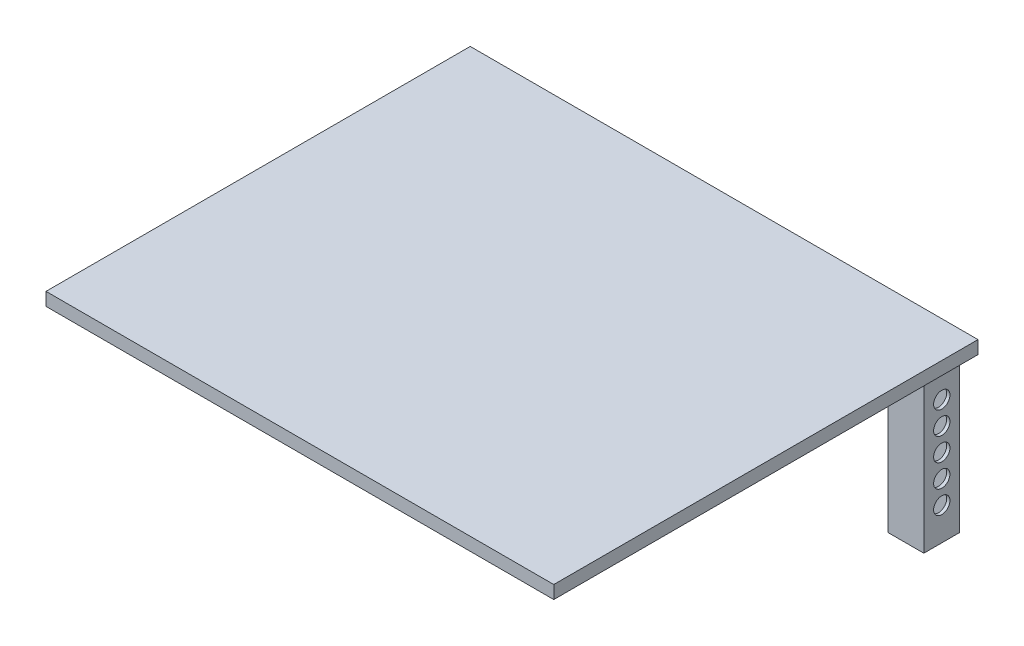
ISO-10303-21;
HEADER;
FILE_DESCRIPTION(('STEP AP214'),'2;1');
FILE_NAME('part.step','',(''),(''),'','','');
FILE_SCHEMA(('AUTOMOTIVE_DESIGN { 1 0 10303 214 1 1 1 1 }'));
ENDSEC;
DATA;
#1=APPLICATION_CONTEXT('core data for automotive mechanical design processes');
#2=APPLICATION_PROTOCOL_DEFINITION('international standard','automotive_design',2000,#1);
#3=PRODUCT_CONTEXT('',#1,'mechanical');
#4=PRODUCT('Part','Part','',(#3));
#5=PRODUCT_RELATED_PRODUCT_CATEGORY('part','',(#4));
#6=PRODUCT_DEFINITION_FORMATION('','',#4);
#7=PRODUCT_DEFINITION_CONTEXT('part definition',#1,'design');
#8=PRODUCT_DEFINITION('design','',#6,#7);
#9=PRODUCT_DEFINITION_SHAPE('','',#8);
#10=(LENGTH_UNIT() NAMED_UNIT(*) SI_UNIT(.MILLI.,.METRE.));
#11=(NAMED_UNIT(*) PLANE_ANGLE_UNIT() SI_UNIT($,.RADIAN.));
#12=(NAMED_UNIT(*) SI_UNIT($,.STERADIAN.) SOLID_ANGLE_UNIT());
#13=UNCERTAINTY_MEASURE_WITH_UNIT(LENGTH_MEASURE(1.E-05),#10,'distance_accuracy_value','');
#14=(GEOMETRIC_REPRESENTATION_CONTEXT(3) GLOBAL_UNCERTAINTY_ASSIGNED_CONTEXT((#13)) GLOBAL_UNIT_ASSIGNED_CONTEXT((#10,
#11,#12)) REPRESENTATION_CONTEXT('',''));
#15=CARTESIAN_POINT('',(0.,0.,0.));
#16=DIRECTION('',(0.,0.,1.));
#17=DIRECTION('',(1.,0.,0.));
#18=AXIS2_PLACEMENT_3D('',#15,#16,#17);
#19=CARTESIAN_POINT('',(-13.97,127.,-13.97));
#20=DIRECTION('',(0.,0.,1.));
#21=DIRECTION('',(1.,0.,0.));
#22=AXIS2_PLACEMENT_3D('',#19,#20,#21);
#23=PLANE('',#22);
#24=DIRECTION('',(0.,1.,0.));
#25=VECTOR('',#24,1.);
#26=CARTESIAN_POINT('',(28.1939999999999,127.,-13.97));
#27=LINE('',#26,#25);
#28=CARTESIAN_POINT('',(28.1939999999999,127.,-13.97));
#29=VERTEX_POINT('',#28);
#30=CARTESIAN_POINT('',(28.1939999999999,137.16,-13.97));
#31=VERTEX_POINT('',#30);
#32=EDGE_CURVE('E144',#29,#31,#27,.T.);
#33=ORIENTED_EDGE('',*,*,#32,.F.);
#34=DIRECTION('',(-1.,0.,0.));
#35=VECTOR('',#34,1.);
#36=CARTESIAN_POINT('',(217.17,127.,-13.97));
#37=LINE('',#36,#35);
#38=CARTESIAN_POINT('',(13.97,127.,-13.97));
#39=VERTEX_POINT('',#38);
#40=EDGE_CURVE('E143',#29,#39,#37,.T.);
#41=ORIENTED_EDGE('',*,*,#40,.T.);
#42=DIRECTION('',(0.,-1.,0.));
#43=VECTOR('',#42,1.);
#44=CARTESIAN_POINT('',(13.97,127.,-13.97));
#45=LINE('',#44,#43);
#46=CARTESIAN_POINT('',(13.97,0.,-13.97));
#47=VERTEX_POINT('',#46);
#48=EDGE_CURVE('E43',#39,#47,#45,.T.);
#49=ORIENTED_EDGE('',*,*,#48,.T.);
#50=DIRECTION('',(-1.,0.,0.));
#51=VECTOR('',#50,1.);
#52=CARTESIAN_POINT('',(-13.97,0.,-13.97));
#53=LINE('',#52,#51);
#54=CARTESIAN_POINT('',(-13.97,0.,-13.97));
#55=VERTEX_POINT('',#54);
#56=EDGE_CURVE('E208',#47,#55,#53,.T.);
#57=ORIENTED_EDGE('',*,*,#56,.T.);
#58=DIRECTION('',(0.,-1.,0.));
#59=VECTOR('',#58,1.);
#60=CARTESIAN_POINT('',(-13.97,127.,-13.97));
#61=LINE('',#60,#59);
#62=CARTESIAN_POINT('',(-13.97,127.,-13.97));
#63=VERTEX_POINT('',#62);
#64=EDGE_CURVE('E217',#63,#55,#61,.T.);
#65=ORIENTED_EDGE('',*,*,#64,.F.);
#66=DIRECTION('',(-1.,0.,0.));
#67=VECTOR('',#66,1.);
#68=CARTESIAN_POINT('',(13.97,127.,-13.97));
#69=LINE('',#68,#67);
#70=CARTESIAN_POINT('',(-367.03,127.,-13.97));
#71=VERTEX_POINT('',#70);
#72=EDGE_CURVE('E155',#63,#71,#69,.T.);
#73=ORIENTED_EDGE('',*,*,#72,.T.);
#74=DIRECTION('',(0.,-1.,0.));
#75=VECTOR('',#74,1.);
#76=CARTESIAN_POINT('',(-367.03,137.16,-13.97));
#77=LINE('',#76,#75);
#78=CARTESIAN_POINT('',(-367.03,137.16,-13.97));
#79=VERTEX_POINT('',#78);
#80=EDGE_CURVE('E160',#79,#71,#77,.T.);
#81=ORIENTED_EDGE('',*,*,#80,.F.);
#82=DIRECTION('',(-1.,0.,0.));
#83=VECTOR('',#82,1.);
#84=CARTESIAN_POINT('',(13.97,137.16,-13.97));
#85=LINE('',#84,#83);
#86=EDGE_CURVE('E150',#31,#79,#85,.T.);
#87=ORIENTED_EDGE('',*,*,#86,.F.);
#88=EDGE_LOOP('',(#33,#41,#49,#57,#65,#73,#81,#87));
#89=FACE_BOUND('',#88,.T.);
#90=ADVANCED_FACE('F39',(#89),#23,.F.);
#91=CARTESIAN_POINT('',(0.,127.,0.));
#92=DIRECTION('',(0.,-1.,0.));
#93=DIRECTION('',(0.,0.,-1.));
#94=AXIS2_PLACEMENT_3D('',#91,#92,#93);
#95=PLANE('',#94);
#96=ORIENTED_EDGE('',*,*,#40,.F.);
#97=DIRECTION('',(0.,0.,-1.));
#98=VECTOR('',#97,1.);
#99=CARTESIAN_POINT('',(28.1939999999999,127.,316.23));
#100=LINE('',#99,#98);
#101=CARTESIAN_POINT('',(28.1939999999999,127.,316.23));
#102=VERTEX_POINT('',#101);
#103=EDGE_CURVE('E130',#102,#29,#100,.T.);
#104=ORIENTED_EDGE('',*,*,#103,.F.);
#105=DIRECTION('',(1.,0.,0.));
#106=VECTOR('',#105,1.);
#107=CARTESIAN_POINT('',(13.97,127.,316.23));
#108=LINE('',#107,#106);
#109=CARTESIAN_POINT('',(-367.03,127.,316.23));
#110=VERTEX_POINT('',#109);
#111=EDGE_CURVE('E142',#110,#102,#108,.T.);
#112=ORIENTED_EDGE('',*,*,#111,.F.);
#113=DIRECTION('',(0.,0.,1.));
#114=VECTOR('',#113,1.);
#115=CARTESIAN_POINT('',(-367.03,127.,-13.97));
#116=LINE('',#115,#114);
#117=EDGE_CURVE('E151',#71,#110,#116,.T.);
#118=ORIENTED_EDGE('',*,*,#117,.F.);
#119=ORIENTED_EDGE('',*,*,#72,.F.);
#120=DIRECTION('',(0.,0.,1.));
#121=VECTOR('',#120,1.);
#122=CARTESIAN_POINT('',(-13.97,127.,-13.97));
#123=LINE('',#122,#121);
#124=CARTESIAN_POINT('',(-13.97,127.,13.97));
#125=VERTEX_POINT('',#124);
#126=EDGE_CURVE('E198',#63,#125,#123,.T.);
#127=ORIENTED_EDGE('',*,*,#126,.T.);
#128=DIRECTION('',(1.,0.,0.));
#129=VECTOR('',#128,1.);
#130=CARTESIAN_POINT('',(-13.97,127.,13.97));
#131=LINE('',#130,#129);
#132=CARTESIAN_POINT('',(13.97,127.,13.97));
#133=VERTEX_POINT('',#132);
#134=EDGE_CURVE('E201',#125,#133,#131,.T.);
#135=ORIENTED_EDGE('',*,*,#134,.T.);
#136=DIRECTION('',(0.,0.,-1.));
#137=VECTOR('',#136,1.);
#138=CARTESIAN_POINT('',(13.97,127.,316.23));
#139=LINE('',#138,#137);
#140=EDGE_CURVE('E11',#133,#39,#139,.T.);
#141=ORIENTED_EDGE('',*,*,#140,.T.);
#142=EDGE_LOOP('',(#96,#104,#112,#118,#119,#127,#135,#141));
#143=FACE_BOUND('',#142,.T.);
#144=ADVANCED_FACE('F140',(#143),#95,.T.);
#145=CARTESIAN_POINT('',(0.,137.16,0.));
#146=DIRECTION('',(0.,-1.,0.));
#147=DIRECTION('',(0.,0.,-1.));
#148=AXIS2_PLACEMENT_3D('',#145,#146,#147);
#149=PLANE('',#148);
#150=DIRECTION('',(0.,0.,1.));
#151=VECTOR('',#150,1.);
#152=CARTESIAN_POINT('',(28.1939999999999,137.16,-13.97));
#153=LINE('',#152,#151);
#154=CARTESIAN_POINT('',(28.1939999999999,137.16,316.23));
#155=VERTEX_POINT('',#154);
#156=EDGE_CURVE('E55',#31,#155,#153,.T.);
#157=ORIENTED_EDGE('',*,*,#156,.F.);
#158=ORIENTED_EDGE('',*,*,#86,.T.);
#159=DIRECTION('',(0.,0.,1.));
#160=VECTOR('',#159,1.);
#161=CARTESIAN_POINT('',(-367.03,137.16,-13.97));
#162=LINE('',#161,#160);
#163=CARTESIAN_POINT('',(-367.03,137.16,316.23));
#164=VERTEX_POINT('',#163);
#165=EDGE_CURVE('E153',#79,#164,#162,.T.);
#166=ORIENTED_EDGE('',*,*,#165,.T.);
#167=DIRECTION('',(1.,0.,0.));
#168=VECTOR('',#167,1.);
#169=CARTESIAN_POINT('',(13.97,137.16,316.23));
#170=LINE('',#169,#168);
#171=EDGE_CURVE('E161',#164,#155,#170,.T.);
#172=ORIENTED_EDGE('',*,*,#171,.T.);
#173=EDGE_LOOP('',(#157,#158,#166,#172));
#174=FACE_BOUND('',#173,.T.);
#175=ADVANCED_FACE('F250',(#174),#149,.F.);
#176=CARTESIAN_POINT('',(13.97,137.16,316.23));
#177=DIRECTION('',(0.,0.,-1.));
#178=DIRECTION('',(-1.,0.,0.));
#179=AXIS2_PLACEMENT_3D('',#176,#177,#178);
#180=PLANE('',#179);
#181=DIRECTION('',(0.,-1.,0.));
#182=VECTOR('',#181,1.);
#183=CARTESIAN_POINT('',(28.1939999999999,137.16,316.23));
#184=LINE('',#183,#182);
#185=EDGE_CURVE('E127',#155,#102,#184,.T.);
#186=ORIENTED_EDGE('',*,*,#185,.F.);
#187=ORIENTED_EDGE('',*,*,#171,.F.);
#188=DIRECTION('',(0.,-1.,0.));
#189=VECTOR('',#188,1.);
#190=CARTESIAN_POINT('',(-367.03,137.16,316.23));
#191=LINE('',#190,#189);
#192=EDGE_CURVE('E149',#164,#110,#191,.T.);
#193=ORIENTED_EDGE('',*,*,#192,.T.);
#194=ORIENTED_EDGE('',*,*,#111,.T.);
#195=EDGE_LOOP('',(#186,#187,#193,#194));
#196=FACE_BOUND('',#195,.T.);
#197=ADVANCED_FACE('F147',(#196),#180,.F.);
#198=CARTESIAN_POINT('',(13.97,127.,-13.97));
#199=DIRECTION('',(-1.,0.,0.));
#200=DIRECTION('',(0.,0.,1.));
#201=AXIS2_PLACEMENT_3D('',#198,#199,#200);
#202=PLANE('',#201);
#203=CARTESIAN_POINT('',(13.97,96.52,0.));
#204=DIRECTION('',(1.,0.,0.));
#205=DIRECTION('',(0.,0.,-1.));
#206=AXIS2_PLACEMENT_3D('',#203,#204,#205);
#207=CIRCLE('',#206,6.35);
#208=CARTESIAN_POINT('',(13.97,96.52,-6.35));
#209=VERTEX_POINT('',#208);
#210=EDGE_CURVE('E455',#209,#209,#207,.T.);
#211=ORIENTED_EDGE('',*,*,#210,.F.);
#212=EDGE_LOOP('',(#211));
#213=FACE_BOUND('',#212,.T.);
#214=CARTESIAN_POINT('',(13.97,78.74,0.));
#215=DIRECTION('',(1.,0.,0.));
#216=DIRECTION('',(0.,0.,-1.));
#217=AXIS2_PLACEMENT_3D('',#214,#215,#216);
#218=CIRCLE('',#217,6.35);
#219=CARTESIAN_POINT('',(13.97,78.74,-6.35));
#220=VERTEX_POINT('',#219);
#221=EDGE_CURVE('E441',#220,#220,#218,.T.);
#222=ORIENTED_EDGE('',*,*,#221,.F.);
#223=EDGE_LOOP('',(#222));
#224=FACE_BOUND('',#223,.T.);
#225=CARTESIAN_POINT('',(13.97,60.96,0.));
#226=DIRECTION('',(1.,0.,0.));
#227=DIRECTION('',(0.,0.,-1.));
#228=AXIS2_PLACEMENT_3D('',#225,#226,#227);
#229=CIRCLE('',#228,6.35);
#230=CARTESIAN_POINT('',(13.97,60.96,-6.35));
#231=VERTEX_POINT('',#230);
#232=EDGE_CURVE('E446',#231,#231,#229,.T.);
#233=ORIENTED_EDGE('',*,*,#232,.F.);
#234=EDGE_LOOP('',(#233));
#235=FACE_BOUND('',#234,.T.);
#236=CARTESIAN_POINT('',(13.97,43.18,0.));
#237=DIRECTION('',(1.,0.,0.));
#238=DIRECTION('',(0.,0.,-1.));
#239=AXIS2_PLACEMENT_3D('',#236,#237,#238);
#240=CIRCLE('',#239,6.35);
#241=CARTESIAN_POINT('',(13.97,43.18,-6.35));
#242=VERTEX_POINT('',#241);
#243=EDGE_CURVE('E472',#242,#242,#240,.T.);
#244=ORIENTED_EDGE('',*,*,#243,.F.);
#245=EDGE_LOOP('',(#244));
#246=FACE_BOUND('',#245,.T.);
#247=CARTESIAN_POINT('',(13.97,25.4,0.));
#248=DIRECTION('',(1.,0.,0.));
#249=DIRECTION('',(0.,0.,-1.));
#250=AXIS2_PLACEMENT_3D('',#247,#248,#249);
#251=CIRCLE('',#250,6.35);
#252=CARTESIAN_POINT('',(13.97,25.4,-6.35));
#253=VERTEX_POINT('',#252);
#254=EDGE_CURVE('E461',#253,#253,#251,.T.);
#255=ORIENTED_EDGE('',*,*,#254,.F.);
#256=EDGE_LOOP('',(#255));
#257=FACE_BOUND('',#256,.T.);
#258=ORIENTED_EDGE('',*,*,#140,.F.);
#259=DIRECTION('',(0.,-1.,0.));
#260=VECTOR('',#259,1.);
#261=CARTESIAN_POINT('',(13.97,127.,13.97));
#262=LINE('',#261,#260);
#263=CARTESIAN_POINT('',(13.97,0.,13.97));
#264=VERTEX_POINT('',#263);
#265=EDGE_CURVE('E205',#133,#264,#262,.T.);
#266=ORIENTED_EDGE('',*,*,#265,.T.);
#267=DIRECTION('',(0.,0.,-1.));
#268=VECTOR('',#267,1.);
#269=CARTESIAN_POINT('',(13.97,0.,-13.97));
#270=LINE('',#269,#268);
#271=EDGE_CURVE('E197',#264,#47,#270,.T.);
#272=ORIENTED_EDGE('',*,*,#271,.T.);
#273=ORIENTED_EDGE('',*,*,#48,.F.);
#274=EDGE_LOOP('',(#258,#266,#272,#273));
#275=FACE_BOUND('',#274,.T.);
#276=ADVANCED_FACE('F41',(#213,#224,#235,#246,#257,#275),#202,.F.);
#277=CARTESIAN_POINT('',(-13.97,127.,-13.97));
#278=DIRECTION('',(1.,0.,0.));
#279=DIRECTION('',(0.,0.,-1.));
#280=AXIS2_PLACEMENT_3D('',#277,#278,#279);
#281=PLANE('',#280);
#282=DIRECTION('',(0.,0.,1.));
#283=VECTOR('',#282,1.);
#284=CARTESIAN_POINT('',(-13.97,0.,-13.97));
#285=LINE('',#284,#283);
#286=CARTESIAN_POINT('',(-13.97,0.,13.97));
#287=VERTEX_POINT('',#286);
#288=EDGE_CURVE('E210',#55,#287,#285,.T.);
#289=ORIENTED_EDGE('',*,*,#288,.T.);
#290=DIRECTION('',(0.,-1.,0.));
#291=VECTOR('',#290,1.);
#292=CARTESIAN_POINT('',(-13.97,127.,13.97));
#293=LINE('',#292,#291);
#294=EDGE_CURVE('E215',#125,#287,#293,.T.);
#295=ORIENTED_EDGE('',*,*,#294,.F.);
#296=ORIENTED_EDGE('',*,*,#126,.F.);
#297=ORIENTED_EDGE('',*,*,#64,.T.);
#298=EDGE_LOOP('',(#289,#295,#296,#297));
#299=FACE_BOUND('',#298,.T.);
#300=ADVANCED_FACE('F235',(#299),#281,.F.);
#301=CARTESIAN_POINT('',(-13.97,127.,13.97));
#302=DIRECTION('',(0.,0.,-1.));
#303=DIRECTION('',(-1.,0.,0.));
#304=AXIS2_PLACEMENT_3D('',#301,#302,#303);
#305=PLANE('',#304);
#306=DIRECTION('',(1.,0.,0.));
#307=VECTOR('',#306,1.);
#308=CARTESIAN_POINT('',(-13.97,0.,13.97));
#309=LINE('',#308,#307);
#310=EDGE_CURVE('E202',#287,#264,#309,.T.);
#311=ORIENTED_EDGE('',*,*,#310,.T.);
#312=ORIENTED_EDGE('',*,*,#265,.F.);
#313=ORIENTED_EDGE('',*,*,#134,.F.);
#314=ORIENTED_EDGE('',*,*,#294,.T.);
#315=EDGE_LOOP('',(#311,#312,#313,#314));
#316=FACE_BOUND('',#315,.T.);
#317=ADVANCED_FACE('F233',(#316),#305,.F.);
#318=CARTESIAN_POINT('',(0.,0.,0.));
#319=DIRECTION('',(0.,1.,0.));
#320=DIRECTION('',(0.,0.,1.));
#321=AXIS2_PLACEMENT_3D('',#318,#319,#320);
#322=PLANE('',#321);
#323=DIRECTION('',(0.,0.,-1.));
#324=VECTOR('',#323,1.);
#325=CARTESIAN_POINT('',(-11.43,0.,-11.43));
#326=LINE('',#325,#324);
#327=CARTESIAN_POINT('',(-11.43,0.,11.43));
#328=VERTEX_POINT('',#327);
#329=CARTESIAN_POINT('',(-11.43,0.,-11.43));
#330=VERTEX_POINT('',#329);
#331=EDGE_CURVE('E165',#328,#330,#326,.T.);
#332=ORIENTED_EDGE('',*,*,#331,.F.);
#333=DIRECTION('',(-1.,0.,0.));
#334=VECTOR('',#333,1.);
#335=CARTESIAN_POINT('',(-11.43,0.,11.43));
#336=LINE('',#335,#334);
#337=CARTESIAN_POINT('',(11.43,0.,11.43));
#338=VERTEX_POINT('',#337);
#339=EDGE_CURVE('E168',#338,#328,#336,.T.);
#340=ORIENTED_EDGE('',*,*,#339,.F.);
#341=DIRECTION('',(0.,0.,1.));
#342=VECTOR('',#341,1.);
#343=CARTESIAN_POINT('',(11.43,0.,11.43));
#344=LINE('',#343,#342);
#345=CARTESIAN_POINT('',(11.43,0.,-11.43));
#346=VERTEX_POINT('',#345);
#347=EDGE_CURVE('E187',#346,#338,#344,.T.);
#348=ORIENTED_EDGE('',*,*,#347,.F.);
#349=DIRECTION('',(1.,0.,0.));
#350=VECTOR('',#349,1.);
#351=CARTESIAN_POINT('',(11.43,0.,-11.43));
#352=LINE('',#351,#350);
#353=EDGE_CURVE('E63',#330,#346,#352,.T.);
#354=ORIENTED_EDGE('',*,*,#353,.F.);
#355=EDGE_LOOP('',(#332,#340,#348,#354));
#356=FACE_BOUND('',#355,.T.);
#357=ORIENTED_EDGE('',*,*,#271,.F.);
#358=ORIENTED_EDGE('',*,*,#310,.F.);
#359=ORIENTED_EDGE('',*,*,#288,.F.);
#360=ORIENTED_EDGE('',*,*,#56,.F.);
#361=EDGE_LOOP('',(#357,#358,#359,#360));
#362=FACE_BOUND('',#361,.T.);
#363=ADVANCED_FACE('F228',(#356,#362),#322,.F.);
#364=CARTESIAN_POINT('',(-11.43,-0.001000000000001,11.43));
#365=DIRECTION('',(0.,0.,1.));
#366=DIRECTION('',(1.,0.,0.));
#367=AXIS2_PLACEMENT_3D('',#364,#365,#366);
#368=PLANE('',#367);
#369=ORIENTED_EDGE('',*,*,#339,.T.);
#370=DIRECTION('',(0.,1.,0.));
#371=VECTOR('',#370,1.);
#372=CARTESIAN_POINT('',(-11.43,-0.001000000000001,11.43));
#373=LINE('',#372,#371);
#374=CARTESIAN_POINT('',(-11.43,127.,11.43));
#375=VERTEX_POINT('',#374);
#376=EDGE_CURVE('E184',#328,#375,#373,.T.);
#377=ORIENTED_EDGE('',*,*,#376,.T.);
#378=DIRECTION('',(1.,0.,0.));
#379=VECTOR('',#378,1.);
#380=CARTESIAN_POINT('',(-11.43,127.,11.43));
#381=LINE('',#380,#379);
#382=CARTESIAN_POINT('',(11.43,127.,11.43));
#383=VERTEX_POINT('',#382);
#384=EDGE_CURVE('E171',#375,#383,#381,.T.);
#385=ORIENTED_EDGE('',*,*,#384,.T.);
#386=DIRECTION('',(0.,1.,0.));
#387=VECTOR('',#386,1.);
#388=CARTESIAN_POINT('',(11.43,-0.001000000000001,11.43));
#389=LINE('',#388,#387);
#390=EDGE_CURVE('E183',#338,#383,#389,.T.);
#391=ORIENTED_EDGE('',*,*,#390,.F.);
#392=EDGE_LOOP('',(#369,#377,#385,#391));
#393=FACE_BOUND('',#392,.T.);
#394=ADVANCED_FACE('F275',(#393),#368,.F.);
#395=CARTESIAN_POINT('',(-11.43,-0.001000000000001,-11.43));
#396=DIRECTION('',(-1.,0.,0.));
#397=DIRECTION('',(0.,0.,1.));
#398=AXIS2_PLACEMENT_3D('',#395,#396,#397);
#399=PLANE('',#398);
#400=ORIENTED_EDGE('',*,*,#331,.T.);
#401=DIRECTION('',(0.,1.,0.));
#402=VECTOR('',#401,1.);
#403=CARTESIAN_POINT('',(-11.43,-0.001000000000001,-11.43));
#404=LINE('',#403,#402);
#405=CARTESIAN_POINT('',(-11.43,127.,-11.43));
#406=VERTEX_POINT('',#405);
#407=EDGE_CURVE('E188',#330,#406,#404,.T.);
#408=ORIENTED_EDGE('',*,*,#407,.T.);
#409=DIRECTION('',(0.,0.,1.));
#410=VECTOR('',#409,1.);
#411=CARTESIAN_POINT('',(-11.43,127.,-11.43));
#412=LINE('',#411,#410);
#413=EDGE_CURVE('E180',#406,#375,#412,.T.);
#414=ORIENTED_EDGE('',*,*,#413,.T.);
#415=ORIENTED_EDGE('',*,*,#376,.F.);
#416=EDGE_LOOP('',(#400,#408,#414,#415));
#417=FACE_BOUND('',#416,.T.);
#418=ADVANCED_FACE('F279',(#417),#399,.F.);
#419=CARTESIAN_POINT('',(11.43,-0.001000000000001,-11.43));
#420=DIRECTION('',(0.,0.,-1.));
#421=DIRECTION('',(-1.,0.,0.));
#422=AXIS2_PLACEMENT_3D('',#419,#420,#421);
#423=PLANE('',#422);
#424=ORIENTED_EDGE('',*,*,#353,.T.);
#425=DIRECTION('',(0.,1.,0.));
#426=VECTOR('',#425,1.);
#427=CARTESIAN_POINT('',(11.43,-0.001000000000001,-11.43));
#428=LINE('',#427,#426);
#429=CARTESIAN_POINT('',(11.43,127.,-11.43));
#430=VERTEX_POINT('',#429);
#431=EDGE_CURVE('E191',#346,#430,#428,.T.);
#432=ORIENTED_EDGE('',*,*,#431,.T.);
#433=DIRECTION('',(-1.,0.,0.));
#434=VECTOR('',#433,1.);
#435=CARTESIAN_POINT('',(11.43,127.,-11.43));
#436=LINE('',#435,#434);
#437=EDGE_CURVE('E177',#430,#406,#436,.T.);
#438=ORIENTED_EDGE('',*,*,#437,.T.);
#439=ORIENTED_EDGE('',*,*,#407,.F.);
#440=EDGE_LOOP('',(#424,#432,#438,#439));
#441=FACE_BOUND('',#440,.T.);
#442=ADVANCED_FACE('F280',(#441),#423,.F.);
#443=CARTESIAN_POINT('',(11.43,-0.001000000000001,11.43));
#444=DIRECTION('',(1.,0.,0.));
#445=DIRECTION('',(0.,0.,-1.));
#446=AXIS2_PLACEMENT_3D('',#443,#444,#445);
#447=PLANE('',#446);
#448=CARTESIAN_POINT('',(11.43,25.4,0.));
#449=DIRECTION('',(1.,0.,0.));
#450=DIRECTION('',(0.,0.,-1.));
#451=AXIS2_PLACEMENT_3D('',#448,#449,#450);
#452=CIRCLE('',#451,6.35);
#453=CARTESIAN_POINT('',(11.43,25.4,-6.35));
#454=VERTEX_POINT('',#453);
#455=EDGE_CURVE('E464',#454,#454,#452,.F.);
#456=ORIENTED_EDGE('',*,*,#455,.F.);
#457=EDGE_LOOP('',(#456));
#458=FACE_BOUND('',#457,.T.);
#459=CARTESIAN_POINT('',(11.43,43.18,0.));
#460=DIRECTION('',(1.,0.,0.));
#461=DIRECTION('',(0.,0.,-1.));
#462=AXIS2_PLACEMENT_3D('',#459,#460,#461);
#463=CIRCLE('',#462,6.35);
#464=CARTESIAN_POINT('',(11.43,43.18,-6.35));
#465=VERTEX_POINT('',#464);
#466=EDGE_CURVE('E468',#465,#465,#463,.F.);
#467=ORIENTED_EDGE('',*,*,#466,.F.);
#468=EDGE_LOOP('',(#467));
#469=FACE_BOUND('',#468,.T.);
#470=CARTESIAN_POINT('',(11.43,60.96,0.));
#471=DIRECTION('',(1.,0.,0.));
#472=DIRECTION('',(0.,0.,-1.));
#473=AXIS2_PLACEMENT_3D('',#470,#471,#472);
#474=CIRCLE('',#473,6.35);
#475=CARTESIAN_POINT('',(11.43,60.96,-6.35));
#476=VERTEX_POINT('',#475);
#477=EDGE_CURVE('E449',#476,#476,#474,.F.);
#478=ORIENTED_EDGE('',*,*,#477,.F.);
#479=EDGE_LOOP('',(#478));
#480=FACE_BOUND('',#479,.T.);
#481=CARTESIAN_POINT('',(11.43,78.74,0.));
#482=DIRECTION('',(1.,0.,0.));
#483=DIRECTION('',(0.,0.,-1.));
#484=AXIS2_PLACEMENT_3D('',#481,#482,#483);
#485=CIRCLE('',#484,6.35);
#486=CARTESIAN_POINT('',(11.43,78.74,-6.35));
#487=VERTEX_POINT('',#486);
#488=EDGE_CURVE('E444',#487,#487,#485,.F.);
#489=ORIENTED_EDGE('',*,*,#488,.F.);
#490=EDGE_LOOP('',(#489));
#491=FACE_BOUND('',#490,.T.);
#492=CARTESIAN_POINT('',(11.43,96.52,0.));
#493=DIRECTION('',(1.,0.,0.));
#494=DIRECTION('',(0.,0.,-1.));
#495=AXIS2_PLACEMENT_3D('',#492,#493,#494);
#496=CIRCLE('',#495,6.35);
#497=CARTESIAN_POINT('',(11.43,96.52,-6.35));
#498=VERTEX_POINT('',#497);
#499=EDGE_CURVE('E451',#498,#498,#496,.F.);
#500=ORIENTED_EDGE('',*,*,#499,.F.);
#501=EDGE_LOOP('',(#500));
#502=FACE_BOUND('',#501,.T.);
#503=ORIENTED_EDGE('',*,*,#347,.T.);
#504=ORIENTED_EDGE('',*,*,#390,.T.);
#505=DIRECTION('',(0.,0.,-1.));
#506=VECTOR('',#505,1.);
#507=CARTESIAN_POINT('',(11.43,127.,11.43));
#508=LINE('',#507,#506);
#509=EDGE_CURVE('E174',#383,#430,#508,.T.);
#510=ORIENTED_EDGE('',*,*,#509,.T.);
#511=ORIENTED_EDGE('',*,*,#431,.F.);
#512=EDGE_LOOP('',(#503,#504,#510,#511));
#513=FACE_BOUND('',#512,.T.);
#514=ADVANCED_FACE('F271',(#458,#469,#480,#491,#502,#513),#447,.F.);
#515=CARTESIAN_POINT('',(-367.03,137.16,-13.97));
#516=DIRECTION('',(1.,0.,0.));
#517=DIRECTION('',(0.,0.,-1.));
#518=AXIS2_PLACEMENT_3D('',#515,#516,#517);
#519=PLANE('',#518);
#520=ORIENTED_EDGE('',*,*,#117,.T.);
#521=ORIENTED_EDGE('',*,*,#192,.F.);
#522=ORIENTED_EDGE('',*,*,#165,.F.);
#523=ORIENTED_EDGE('',*,*,#80,.T.);
#524=EDGE_LOOP('',(#520,#521,#522,#523));
#525=FACE_BOUND('',#524,.T.);
#526=ADVANCED_FACE('F261',(#525),#519,.F.);
#527=ORIENTED_EDGE('',*,*,#384,.F.);
#528=ORIENTED_EDGE('',*,*,#413,.F.);
#529=ORIENTED_EDGE('',*,*,#437,.F.);
#530=ORIENTED_EDGE('',*,*,#509,.F.);
#531=EDGE_LOOP('',(#527,#528,#529,#530));
#532=FACE_BOUND('',#531,.T.);
#533=ADVANCED_FACE('F252',(#532),#95,.T.);
#534=CARTESIAN_POINT('',(-367.031,96.52,0.));
#535=DIRECTION('',(1.,0.,0.));
#536=DIRECTION('',(0.,0.,-1.));
#537=AXIS2_PLACEMENT_3D('',#534,#535,#536);
#538=CYLINDRICAL_SURFACE('',#537,6.35);
#539=ORIENTED_EDGE('',*,*,#210,.T.);
#540=EDGE_LOOP('',(#539));
#541=FACE_BOUND('',#540,.T.);
#542=ORIENTED_EDGE('',*,*,#499,.T.);
#543=EDGE_LOOP('',(#542));
#544=FACE_BOUND('',#543,.T.);
#545=ADVANCED_FACE('F260',(#541,#544),#538,.F.);
#546=CARTESIAN_POINT('',(-367.031,78.74,0.));
#547=DIRECTION('',(1.,0.,0.));
#548=DIRECTION('',(0.,0.,-1.));
#549=AXIS2_PLACEMENT_3D('',#546,#547,#548);
#550=CYLINDRICAL_SURFACE('',#549,6.35);
#551=ORIENTED_EDGE('',*,*,#221,.T.);
#552=EDGE_LOOP('',(#551));
#553=FACE_BOUND('',#552,.T.);
#554=ORIENTED_EDGE('',*,*,#488,.T.);
#555=EDGE_LOOP('',(#554));
#556=FACE_BOUND('',#555,.T.);
#557=ADVANCED_FACE('F268',(#553,#556),#550,.F.);
#558=CARTESIAN_POINT('',(-367.031,60.96,0.));
#559=DIRECTION('',(1.,0.,0.));
#560=DIRECTION('',(0.,0.,-1.));
#561=AXIS2_PLACEMENT_3D('',#558,#559,#560);
#562=CYLINDRICAL_SURFACE('',#561,6.35);
#563=ORIENTED_EDGE('',*,*,#232,.T.);
#564=EDGE_LOOP('',(#563));
#565=FACE_BOUND('',#564,.T.);
#566=ORIENTED_EDGE('',*,*,#477,.T.);
#567=EDGE_LOOP('',(#566));
#568=FACE_BOUND('',#567,.T.);
#569=ADVANCED_FACE('F360',(#565,#568),#562,.F.);
#570=CARTESIAN_POINT('',(-367.031,43.18,0.));
#571=DIRECTION('',(1.,0.,0.));
#572=DIRECTION('',(0.,0.,-1.));
#573=AXIS2_PLACEMENT_3D('',#570,#571,#572);
#574=CYLINDRICAL_SURFACE('',#573,6.35);
#575=ORIENTED_EDGE('',*,*,#243,.T.);
#576=EDGE_LOOP('',(#575));
#577=FACE_BOUND('',#576,.T.);
#578=ORIENTED_EDGE('',*,*,#466,.T.);
#579=EDGE_LOOP('',(#578));
#580=FACE_BOUND('',#579,.T.);
#581=ADVANCED_FACE('F351',(#577,#580),#574,.F.);
#582=CARTESIAN_POINT('',(-367.031,25.4,0.));
#583=DIRECTION('',(1.,0.,0.));
#584=DIRECTION('',(0.,0.,-1.));
#585=AXIS2_PLACEMENT_3D('',#582,#583,#584);
#586=CYLINDRICAL_SURFACE('',#585,6.35);
#587=ORIENTED_EDGE('',*,*,#254,.T.);
#588=EDGE_LOOP('',(#587));
#589=FACE_BOUND('',#588,.T.);
#590=ORIENTED_EDGE('',*,*,#455,.T.);
#591=EDGE_LOOP('',(#590));
#592=FACE_BOUND('',#591,.T.);
#593=ADVANCED_FACE('F305',(#589,#592),#586,.F.);
#594=CARTESIAN_POINT('',(28.1939999999999,0.,0.));
#595=DIRECTION('',(1.,0.,0.));
#596=DIRECTION('',(0.,0.,-1.));
#597=AXIS2_PLACEMENT_3D('',#594,#595,#596);
#598=PLANE('',#597);
#599=ORIENTED_EDGE('',*,*,#156,.T.);
#600=ORIENTED_EDGE('',*,*,#185,.T.);
#601=ORIENTED_EDGE('',*,*,#103,.T.);
#602=ORIENTED_EDGE('',*,*,#32,.T.);
#603=EDGE_LOOP('',(#599,#600,#601,#602));
#604=FACE_BOUND('',#603,.T.);
#605=ADVANCED_FACE('F129',(#604),#598,.T.);
#606=CLOSED_SHELL('',(#90,#144,#175,#197,#276,#300,#317,#363,#394,#418,#442,#514,#526,#533,#545,
#557,#569,#581,#593,#605));
#607=MANIFOLD_SOLID_BREP('B2',#606);
#608=ADVANCED_BREP_SHAPE_REPRESENTATION('',(#18,#607),#14);
#609=SHAPE_DEFINITION_REPRESENTATION(#9,#608);
ENDSEC;
END-ISO-10303-21;
